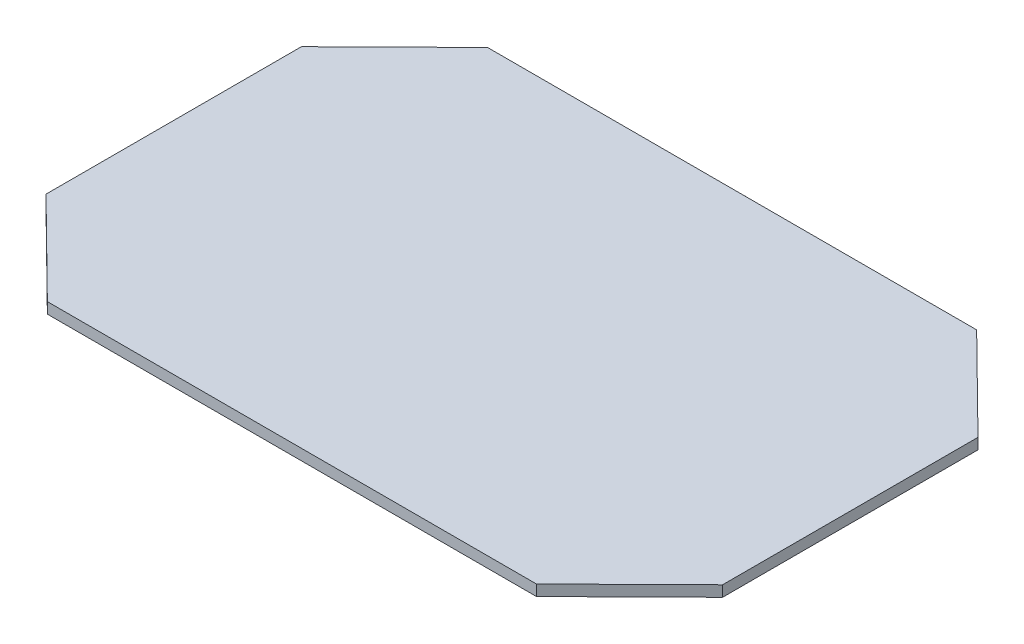
ISO-10303-21;
HEADER;
FILE_DESCRIPTION(('STEP AP214'),'2;1');
FILE_NAME('part.step','',(''),(''),'','','');
FILE_SCHEMA(('AUTOMOTIVE_DESIGN { 1 0 10303 214 1 1 1 1 }'));
ENDSEC;
DATA;
#1=APPLICATION_CONTEXT('core data for automotive mechanical design processes');
#2=APPLICATION_PROTOCOL_DEFINITION('international standard','automotive_design',2000,#1);
#3=PRODUCT_CONTEXT('',#1,'mechanical');
#4=PRODUCT('Part','Part','',(#3));
#5=PRODUCT_RELATED_PRODUCT_CATEGORY('part','',(#4));
#6=PRODUCT_DEFINITION_FORMATION('','',#4);
#7=PRODUCT_DEFINITION_CONTEXT('part definition',#1,'design');
#8=PRODUCT_DEFINITION('design','',#6,#7);
#9=PRODUCT_DEFINITION_SHAPE('','',#8);
#10=(LENGTH_UNIT() NAMED_UNIT(*) SI_UNIT(.MILLI.,.METRE.));
#11=(NAMED_UNIT(*) PLANE_ANGLE_UNIT() SI_UNIT($,.RADIAN.));
#12=(NAMED_UNIT(*) SI_UNIT($,.STERADIAN.) SOLID_ANGLE_UNIT());
#13=UNCERTAINTY_MEASURE_WITH_UNIT(LENGTH_MEASURE(1.E-05),#10,'distance_accuracy_value','');
#14=(GEOMETRIC_REPRESENTATION_CONTEXT(3) GLOBAL_UNCERTAINTY_ASSIGNED_CONTEXT((#13)) GLOBAL_UNIT_ASSIGNED_CONTEXT((#10,
#11,#12)) REPRESENTATION_CONTEXT('',''));
#15=CARTESIAN_POINT('',(0.,0.,0.));
#16=DIRECTION('',(0.,0.,1.));
#17=DIRECTION('',(1.,0.,0.));
#18=AXIS2_PLACEMENT_3D('',#15,#16,#17);
#19=CARTESIAN_POINT('',(-90.,4.,-81.));
#20=DIRECTION('',(0.701926718971864,0.,0.71224917072145));
#21=DIRECTION('',(0.71224917072145,0.,-0.701926718971864));
#22=AXIS2_PLACEMENT_3D('',#19,#20,#21);
#23=PLANE('',#22);
#24=DIRECTION('',(-0.71224917072145,0.,0.701926718971864));
#25=VECTOR('',#24,1.);
#26=CARTESIAN_POINT('',(-90.,0.,-81.));
#27=LINE('',#26,#25);
#28=CARTESIAN_POINT('',(-90.,0.,-81.));
#29=VERTEX_POINT('',#28);
#30=CARTESIAN_POINT('',(-124.5,0.,-47.));
#31=VERTEX_POINT('',#30);
#32=EDGE_CURVE('E133',#29,#31,#27,.T.);
#33=ORIENTED_EDGE('',*,*,#32,.T.);
#34=DIRECTION('',(0.,-1.,0.));
#35=VECTOR('',#34,1.);
#36=CARTESIAN_POINT('',(-124.5,4.,-47.));
#37=LINE('',#36,#35);
#38=CARTESIAN_POINT('',(-124.5,4.,-47.));
#39=VERTEX_POINT('',#38);
#40=EDGE_CURVE('E41',#39,#31,#37,.T.);
#41=ORIENTED_EDGE('',*,*,#40,.F.);
#42=DIRECTION('',(-0.71224917072145,0.,0.701926718971864));
#43=VECTOR('',#42,1.);
#44=CARTESIAN_POINT('',(-90.,4.,-81.));
#45=LINE('',#44,#43);
#46=CARTESIAN_POINT('',(-90.,4.,-81.));
#47=VERTEX_POINT('',#46);
#48=EDGE_CURVE('E93',#47,#39,#45,.T.);
#49=ORIENTED_EDGE('',*,*,#48,.F.);
#50=DIRECTION('',(0.,-1.,0.));
#51=VECTOR('',#50,1.);
#52=CARTESIAN_POINT('',(-90.,4.,-81.));
#53=LINE('',#52,#51);
#54=EDGE_CURVE('E11',#47,#29,#53,.T.);
#55=ORIENTED_EDGE('',*,*,#54,.T.);
#56=EDGE_LOOP('',(#33,#41,#49,#55));
#57=FACE_BOUND('',#56,.T.);
#58=ADVANCED_FACE('F33',(#57),#23,.F.);
#59=CARTESIAN_POINT('',(-124.5,4.,47.));
#60=DIRECTION('',(1.,0.,0.));
#61=DIRECTION('',(0.,0.,-1.));
#62=AXIS2_PLACEMENT_3D('',#59,#60,#61);
#63=PLANE('',#62);
#64=DIRECTION('',(0.,0.,1.));
#65=VECTOR('',#64,1.);
#66=CARTESIAN_POINT('',(-124.5,0.,47.));
#67=LINE('',#66,#65);
#68=CARTESIAN_POINT('',(-124.5,0.,47.));
#69=VERTEX_POINT('',#68);
#70=EDGE_CURVE('E135',#31,#69,#67,.T.);
#71=ORIENTED_EDGE('',*,*,#70,.T.);
#72=DIRECTION('',(0.,-1.,0.));
#73=VECTOR('',#72,1.);
#74=CARTESIAN_POINT('',(-124.5,4.,47.));
#75=LINE('',#74,#73);
#76=CARTESIAN_POINT('',(-124.5,4.,47.));
#77=VERTEX_POINT('',#76);
#78=EDGE_CURVE('E153',#77,#69,#75,.T.);
#79=ORIENTED_EDGE('',*,*,#78,.F.);
#80=DIRECTION('',(0.,0.,1.));
#81=VECTOR('',#80,1.);
#82=CARTESIAN_POINT('',(-124.5,4.,47.));
#83=LINE('',#82,#81);
#84=EDGE_CURVE('E161',#39,#77,#83,.T.);
#85=ORIENTED_EDGE('',*,*,#84,.F.);
#86=ORIENTED_EDGE('',*,*,#40,.T.);
#87=EDGE_LOOP('',(#71,#79,#85,#86));
#88=FACE_BOUND('',#87,.T.);
#89=ADVANCED_FACE('F159',(#88),#63,.F.);
#90=CARTESIAN_POINT('',(-90.,4.,81.));
#91=DIRECTION('',(0.701926718971864,0.,-0.71224917072145));
#92=DIRECTION('',(-0.71224917072145,0.,-0.701926718971864));
#93=AXIS2_PLACEMENT_3D('',#90,#91,#92);
#94=PLANE('',#93);
#95=DIRECTION('',(0.71224917072145,0.,0.701926718971864));
#96=VECTOR('',#95,1.);
#97=CARTESIAN_POINT('',(-90.,0.,81.));
#98=LINE('',#97,#96);
#99=CARTESIAN_POINT('',(-90.,0.,81.));
#100=VERTEX_POINT('',#99);
#101=EDGE_CURVE('E137',#69,#100,#98,.T.);
#102=ORIENTED_EDGE('',*,*,#101,.T.);
#103=DIRECTION('',(0.,-1.,0.));
#104=VECTOR('',#103,1.);
#105=CARTESIAN_POINT('',(-90.,4.,81.));
#106=LINE('',#105,#104);
#107=CARTESIAN_POINT('',(-90.,4.,81.));
#108=VERTEX_POINT('',#107);
#109=EDGE_CURVE('E150',#108,#100,#106,.T.);
#110=ORIENTED_EDGE('',*,*,#109,.F.);
#111=DIRECTION('',(0.71224917072145,0.,0.701926718971864));
#112=VECTOR('',#111,1.);
#113=CARTESIAN_POINT('',(-90.,4.,81.));
#114=LINE('',#113,#112);
#115=EDGE_CURVE('E173',#77,#108,#114,.T.);
#116=ORIENTED_EDGE('',*,*,#115,.F.);
#117=ORIENTED_EDGE('',*,*,#78,.T.);
#118=EDGE_LOOP('',(#102,#110,#116,#117));
#119=FACE_BOUND('',#118,.T.);
#120=ADVANCED_FACE('F169',(#119),#94,.F.);
#121=CARTESIAN_POINT('',(0.,4.,81.));
#122=DIRECTION('',(0.,0.,-1.));
#123=DIRECTION('',(-1.,0.,0.));
#124=AXIS2_PLACEMENT_3D('',#121,#122,#123);
#125=PLANE('',#124);
#126=DIRECTION('',(1.,0.,0.));
#127=VECTOR('',#126,1.);
#128=CARTESIAN_POINT('',(0.,0.,81.));
#129=LINE('',#128,#127);
#130=CARTESIAN_POINT('',(89.9999999999999,0.,81.));
#131=VERTEX_POINT('',#130);
#132=EDGE_CURVE('E140',#100,#131,#129,.T.);
#133=ORIENTED_EDGE('',*,*,#132,.T.);
#134=DIRECTION('',(0.,-1.,0.));
#135=VECTOR('',#134,1.);
#136=CARTESIAN_POINT('',(89.9999999999999,4.,81.));
#137=LINE('',#136,#135);
#138=CARTESIAN_POINT('',(89.9999999999999,4.,81.));
#139=VERTEX_POINT('',#138);
#140=EDGE_CURVE('E122',#139,#131,#137,.T.);
#141=ORIENTED_EDGE('',*,*,#140,.F.);
#142=DIRECTION('',(1.,0.,0.));
#143=VECTOR('',#142,1.);
#144=CARTESIAN_POINT('',(-90.,4.,81.));
#145=LINE('',#144,#143);
#146=EDGE_CURVE('E113',#108,#139,#145,.T.);
#147=ORIENTED_EDGE('',*,*,#146,.F.);
#148=ORIENTED_EDGE('',*,*,#109,.T.);
#149=EDGE_LOOP('',(#133,#141,#147,#148));
#150=FACE_BOUND('',#149,.T.);
#151=ADVANCED_FACE('F172',(#150),#125,.F.);
#152=CARTESIAN_POINT('',(124.5,4.,47.));
#153=DIRECTION('',(-0.701926718971864,0.,-0.712249170721451));
#154=DIRECTION('',(-0.712249170721451,0.,0.701926718971864));
#155=AXIS2_PLACEMENT_3D('',#152,#153,#154);
#156=PLANE('',#155);
#157=DIRECTION('',(0.712249170721451,0.,-0.701926718971864));
#158=VECTOR('',#157,1.);
#159=CARTESIAN_POINT('',(124.5,0.,47.));
#160=LINE('',#159,#158);
#161=CARTESIAN_POINT('',(124.5,0.,47.));
#162=VERTEX_POINT('',#161);
#163=EDGE_CURVE('E121',#131,#162,#160,.T.);
#164=ORIENTED_EDGE('',*,*,#163,.T.);
#165=DIRECTION('',(0.,-1.,0.));
#166=VECTOR('',#165,1.);
#167=CARTESIAN_POINT('',(124.5,4.,47.));
#168=LINE('',#167,#166);
#169=CARTESIAN_POINT('',(124.5,4.,47.));
#170=VERTEX_POINT('',#169);
#171=EDGE_CURVE('E118',#170,#162,#168,.T.);
#172=ORIENTED_EDGE('',*,*,#171,.F.);
#173=DIRECTION('',(0.712249170721451,0.,-0.701926718971864));
#174=VECTOR('',#173,1.);
#175=CARTESIAN_POINT('',(124.5,4.,47.));
#176=LINE('',#175,#174);
#177=EDGE_CURVE('E107',#139,#170,#176,.T.);
#178=ORIENTED_EDGE('',*,*,#177,.F.);
#179=ORIENTED_EDGE('',*,*,#140,.T.);
#180=EDGE_LOOP('',(#164,#172,#178,#179));
#181=FACE_BOUND('',#180,.T.);
#182=ADVANCED_FACE('F119',(#181),#156,.F.);
#183=CARTESIAN_POINT('',(124.5,4.,47.));
#184=DIRECTION('',(-1.,0.,0.));
#185=DIRECTION('',(0.,0.,1.));
#186=AXIS2_PLACEMENT_3D('',#183,#184,#185);
#187=PLANE('',#186);
#188=DIRECTION('',(0.,0.,-1.));
#189=VECTOR('',#188,1.);
#190=CARTESIAN_POINT('',(124.5,0.,47.));
#191=LINE('',#190,#189);
#192=CARTESIAN_POINT('',(124.5,0.,-47.));
#193=VERTEX_POINT('',#192);
#194=EDGE_CURVE('E79',#162,#193,#191,.T.);
#195=ORIENTED_EDGE('',*,*,#194,.T.);
#196=DIRECTION('',(0.,-1.,0.));
#197=VECTOR('',#196,1.);
#198=CARTESIAN_POINT('',(124.5,4.,-47.));
#199=LINE('',#198,#197);
#200=CARTESIAN_POINT('',(124.5,4.,-47.));
#201=VERTEX_POINT('',#200);
#202=EDGE_CURVE('E123',#201,#193,#199,.T.);
#203=ORIENTED_EDGE('',*,*,#202,.F.);
#204=DIRECTION('',(0.,0.,-1.));
#205=VECTOR('',#204,1.);
#206=CARTESIAN_POINT('',(124.5,4.,47.));
#207=LINE('',#206,#205);
#208=EDGE_CURVE('E111',#170,#201,#207,.T.);
#209=ORIENTED_EDGE('',*,*,#208,.F.);
#210=ORIENTED_EDGE('',*,*,#171,.T.);
#211=EDGE_LOOP('',(#195,#203,#209,#210));
#212=FACE_BOUND('',#211,.T.);
#213=ADVANCED_FACE('F125',(#212),#187,.F.);
#214=CARTESIAN_POINT('',(124.5,4.,-47.));
#215=DIRECTION('',(-0.701926718971864,0.,0.712249170721451));
#216=DIRECTION('',(0.712249170721451,0.,0.701926718971864));
#217=AXIS2_PLACEMENT_3D('',#214,#215,#216);
#218=PLANE('',#217);
#219=DIRECTION('',(-0.712249170721451,0.,-0.701926718971864));
#220=VECTOR('',#219,1.);
#221=CARTESIAN_POINT('',(124.5,0.,-47.));
#222=LINE('',#221,#220);
#223=CARTESIAN_POINT('',(90.,0.,-81.));
#224=VERTEX_POINT('',#223);
#225=EDGE_CURVE('E86',#193,#224,#222,.T.);
#226=ORIENTED_EDGE('',*,*,#225,.T.);
#227=DIRECTION('',(0.,-1.,0.));
#228=VECTOR('',#227,1.);
#229=CARTESIAN_POINT('',(90.,4.,-81.));
#230=LINE('',#229,#228);
#231=CARTESIAN_POINT('',(90.,4.,-81.));
#232=VERTEX_POINT('',#231);
#233=EDGE_CURVE('E129',#232,#224,#230,.T.);
#234=ORIENTED_EDGE('',*,*,#233,.F.);
#235=DIRECTION('',(-0.712249170721451,0.,-0.701926718971864));
#236=VECTOR('',#235,1.);
#237=CARTESIAN_POINT('',(124.5,4.,-47.));
#238=LINE('',#237,#236);
#239=EDGE_CURVE('E127',#201,#232,#238,.T.);
#240=ORIENTED_EDGE('',*,*,#239,.F.);
#241=ORIENTED_EDGE('',*,*,#202,.T.);
#242=EDGE_LOOP('',(#226,#234,#240,#241));
#243=FACE_BOUND('',#242,.T.);
#244=ADVANCED_FACE('F194',(#243),#218,.F.);
#245=CARTESIAN_POINT('',(0.,4.,-81.));
#246=DIRECTION('',(0.,0.,1.));
#247=DIRECTION('',(1.,0.,0.));
#248=AXIS2_PLACEMENT_3D('',#245,#246,#247);
#249=PLANE('',#248);
#250=DIRECTION('',(-1.,0.,0.));
#251=VECTOR('',#250,1.);
#252=CARTESIAN_POINT('',(0.,0.,-81.));
#253=LINE('',#252,#251);
#254=EDGE_CURVE('E145',#224,#29,#253,.T.);
#255=ORIENTED_EDGE('',*,*,#254,.T.);
#256=ORIENTED_EDGE('',*,*,#54,.F.);
#257=DIRECTION('',(-1.,0.,0.));
#258=VECTOR('',#257,1.);
#259=CARTESIAN_POINT('',(-90.,4.,-81.));
#260=LINE('',#259,#258);
#261=EDGE_CURVE('E49',#232,#47,#260,.T.);
#262=ORIENTED_EDGE('',*,*,#261,.F.);
#263=ORIENTED_EDGE('',*,*,#233,.T.);
#264=EDGE_LOOP('',(#255,#256,#262,#263));
#265=FACE_BOUND('',#264,.T.);
#266=ADVANCED_FACE('F178',(#265),#249,.F.);
#267=CARTESIAN_POINT('',(0.,4.,0.));
#268=DIRECTION('',(0.,1.,0.));
#269=DIRECTION('',(0.,0.,1.));
#270=AXIS2_PLACEMENT_3D('',#267,#268,#269);
#271=PLANE('',#270);
#272=ORIENTED_EDGE('',*,*,#261,.T.);
#273=ORIENTED_EDGE('',*,*,#48,.T.);
#274=ORIENTED_EDGE('',*,*,#84,.T.);
#275=ORIENTED_EDGE('',*,*,#115,.T.);
#276=ORIENTED_EDGE('',*,*,#146,.T.);
#277=ORIENTED_EDGE('',*,*,#177,.T.);
#278=ORIENTED_EDGE('',*,*,#208,.T.);
#279=ORIENTED_EDGE('',*,*,#239,.T.);
#280=EDGE_LOOP('',(#272,#273,#274,#275,#276,#277,#278,#279));
#281=FACE_BOUND('',#280,.T.);
#282=ADVANCED_FACE('F109',(#281),#271,.T.);
#283=CARTESIAN_POINT('',(0.,0.,0.));
#284=DIRECTION('',(0.,1.,0.));
#285=DIRECTION('',(0.,0.,1.));
#286=AXIS2_PLACEMENT_3D('',#283,#284,#285);
#287=PLANE('',#286);
#288=ORIENTED_EDGE('',*,*,#32,.F.);
#289=ORIENTED_EDGE('',*,*,#254,.F.);
#290=ORIENTED_EDGE('',*,*,#225,.F.);
#291=ORIENTED_EDGE('',*,*,#194,.F.);
#292=ORIENTED_EDGE('',*,*,#163,.F.);
#293=ORIENTED_EDGE('',*,*,#132,.F.);
#294=ORIENTED_EDGE('',*,*,#101,.F.);
#295=ORIENTED_EDGE('',*,*,#70,.F.);
#296=EDGE_LOOP('',(#288,#289,#290,#291,#292,#293,#294,#295));
#297=FACE_BOUND('',#296,.T.);
#298=ADVANCED_FACE('F165',(#297),#287,.F.);
#299=CLOSED_SHELL('',(#58,#89,#120,#151,#182,#213,#244,#266,#282,#298));
#300=MANIFOLD_SOLID_BREP('B2',#299);
#301=ADVANCED_BREP_SHAPE_REPRESENTATION('',(#18,#300),#14);
#302=SHAPE_DEFINITION_REPRESENTATION(#9,#301);
ENDSEC;
END-ISO-10303-21;
